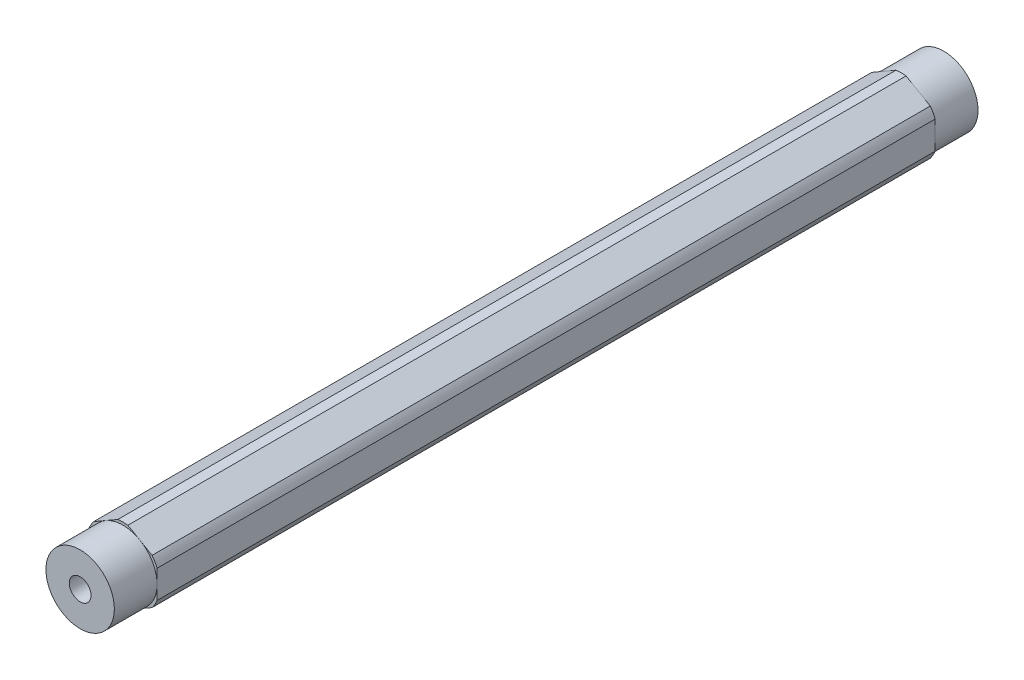
ISO-10303-21;
HEADER;
FILE_DESCRIPTION(('STEP AP214'),'2;1');
FILE_NAME('part.step','',(''),(''),'','','');
FILE_SCHEMA(('AUTOMOTIVE_DESIGN { 1 0 10303 214 1 1 1 1 }'));
ENDSEC;
DATA;
#1=APPLICATION_CONTEXT('core data for automotive mechanical design processes');
#2=APPLICATION_PROTOCOL_DEFINITION('international standard','automotive_design',2000,#1);
#3=PRODUCT_CONTEXT('',#1,'mechanical');
#4=PRODUCT('Part','Part','',(#3));
#5=PRODUCT_RELATED_PRODUCT_CATEGORY('part','',(#4));
#6=PRODUCT_DEFINITION_FORMATION('','',#4);
#7=PRODUCT_DEFINITION_CONTEXT('part definition',#1,'design');
#8=PRODUCT_DEFINITION('design','',#6,#7);
#9=PRODUCT_DEFINITION_SHAPE('','',#8);
#10=(LENGTH_UNIT() NAMED_UNIT(*) SI_UNIT(.MILLI.,.METRE.));
#11=(NAMED_UNIT(*) PLANE_ANGLE_UNIT() SI_UNIT($,.RADIAN.));
#12=(NAMED_UNIT(*) SI_UNIT($,.STERADIAN.) SOLID_ANGLE_UNIT());
#13=UNCERTAINTY_MEASURE_WITH_UNIT(LENGTH_MEASURE(1.E-05),#10,'distance_accuracy_value','');
#14=(GEOMETRIC_REPRESENTATION_CONTEXT(3) GLOBAL_UNCERTAINTY_ASSIGNED_CONTEXT((#13)) GLOBAL_UNIT_ASSIGNED_CONTEXT((#10,
#11,#12)) REPRESENTATION_CONTEXT('',''));
#15=CARTESIAN_POINT('',(0.,0.,0.));
#16=DIRECTION('',(0.,0.,1.));
#17=DIRECTION('',(1.,0.,0.));
#18=AXIS2_PLACEMENT_3D('',#15,#16,#17);
#19=CARTESIAN_POINT('',(0.,0.,-72.23125));
#20=DIRECTION('',(0.,0.,1.));
#21=DIRECTION('',(1.,0.,0.));
#22=AXIS2_PLACEMENT_3D('',#19,#20,#21);
#23=PLANE('',#22);
#24=DIRECTION('',(0.,1.,0.));
#25=VECTOR('',#24,1.);
#26=CARTESIAN_POINT('',(6.35,0.,-72.23125));
#27=LINE('',#26,#25);
#28=CARTESIAN_POINT('',(6.35,0.,-72.23125));
#29=VERTEX_POINT('',#28);
#30=CARTESIAN_POINT('',(6.35,2.59030191290514,-72.23125));
#31=VERTEX_POINT('',#30);
#32=EDGE_CURVE('E182',#29,#31,#27,.T.);
#33=ORIENTED_EDGE('',*,*,#32,.F.);
#34=CARTESIAN_POINT('',(0.,0.,-72.23125));
#35=DIRECTION('',(0.,0.,1.));
#36=DIRECTION('',(1.,0.,0.));
#37=AXIS2_PLACEMENT_3D('',#34,#35,#36);
#38=CIRCLE('',#37,6.35);
#39=CARTESIAN_POINT('',(3.175,5.49926131403119,-72.23125));
#40=VERTEX_POINT('',#39);
#41=EDGE_CURVE('E57',#29,#40,#38,.T.);
#42=ORIENTED_EDGE('',*,*,#41,.T.);
#43=DIRECTION('',(-0.866025403784439,0.5,0.));
#44=VECTOR('',#43,1.);
#45=CARTESIAN_POINT('',(3.175,5.49926131403119,-72.23125));
#46=LINE('',#45,#44);
#47=CARTESIAN_POINT('',(5.41826726004727,4.20411035757862,-72.23125));
#48=VERTEX_POINT('',#47);
#49=EDGE_CURVE('E181',#48,#40,#46,.T.);
#50=ORIENTED_EDGE('',*,*,#49,.F.);
#51=CARTESIAN_POINT('',(0.,0.,-72.23125));
#52=DIRECTION('',(0.,0.,1.));
#53=DIRECTION('',(1.,0.,0.));
#54=AXIS2_PLACEMENT_3D('',#51,#52,#53);
#55=CIRCLE('',#54,6.858);
#56=EDGE_CURVE('E196',#31,#48,#55,.T.);
#57=ORIENTED_EDGE('',*,*,#56,.F.);
#58=EDGE_LOOP('',(#33,#42,#50,#57));
#59=FACE_BOUND('',#58,.T.);
#60=ADVANCED_FACE('F45',(#59),#23,.F.);
#61=CARTESIAN_POINT('',(0.931732739952725,6.79441227048375,-72.23125));
#62=VERTEX_POINT('',#61);
#63=EDGE_CURVE('E189',#40,#62,#46,.T.);
#64=ORIENTED_EDGE('',*,*,#63,.F.);
#65=CARTESIAN_POINT('',(-3.175,5.49926131403119,-72.23125));
#66=VERTEX_POINT('',#65);
#67=EDGE_CURVE('E11',#40,#66,#38,.T.);
#68=ORIENTED_EDGE('',*,*,#67,.T.);
#69=DIRECTION('',(-0.866025403784439,-0.5,0.));
#70=VECTOR('',#69,1.);
#71=CARTESIAN_POINT('',(-3.175,5.49926131403118,-72.23125));
#72=LINE('',#71,#70);
#73=CARTESIAN_POINT('',(-0.931732739952721,6.79441227048375,-72.23125));
#74=VERTEX_POINT('',#73);
#75=EDGE_CURVE('E210',#74,#66,#72,.T.);
#76=ORIENTED_EDGE('',*,*,#75,.F.);
#77=EDGE_CURVE('E191',#62,#74,#55,.T.);
#78=ORIENTED_EDGE('',*,*,#77,.F.);
#79=EDGE_LOOP('',(#64,#68,#76,#78));
#80=FACE_BOUND('',#79,.T.);
#81=ADVANCED_FACE('F190',(#80),#23,.F.);
#82=CARTESIAN_POINT('',(-5.41826726004728,4.20411035757862,-72.23125));
#83=VERTEX_POINT('',#82);
#84=EDGE_CURVE('E205',#66,#83,#72,.T.);
#85=ORIENTED_EDGE('',*,*,#84,.F.);
#86=CARTESIAN_POINT('',(-6.35,0.,-72.23125));
#87=VERTEX_POINT('',#86);
#88=EDGE_CURVE('E55',#66,#87,#38,.T.);
#89=ORIENTED_EDGE('',*,*,#88,.T.);
#90=DIRECTION('',(0.,-1.,0.));
#91=VECTOR('',#90,1.);
#92=CARTESIAN_POINT('',(-6.35,0.,-72.23125));
#93=LINE('',#92,#91);
#94=CARTESIAN_POINT('',(-6.35,2.59030191290514,-72.23125));
#95=VERTEX_POINT('',#94);
#96=EDGE_CURVE('E214',#95,#87,#93,.T.);
#97=ORIENTED_EDGE('',*,*,#96,.F.);
#98=EDGE_CURVE('E207',#83,#95,#55,.T.);
#99=ORIENTED_EDGE('',*,*,#98,.F.);
#100=EDGE_LOOP('',(#85,#89,#97,#99));
#101=FACE_BOUND('',#100,.T.);
#102=ADVANCED_FACE('F433',(#101),#23,.F.);
#103=CARTESIAN_POINT('',(-6.35,-2.59030191290514,-72.23125));
#104=VERTEX_POINT('',#103);
#105=EDGE_CURVE('E219',#87,#104,#93,.T.);
#106=ORIENTED_EDGE('',*,*,#105,.F.);
#107=CARTESIAN_POINT('',(-3.175,-5.49926131403119,-72.23125));
#108=VERTEX_POINT('',#107);
#109=EDGE_CURVE('E397',#87,#108,#38,.T.);
#110=ORIENTED_EDGE('',*,*,#109,.T.);
#111=DIRECTION('',(0.866025403784439,-0.5,0.));
#112=VECTOR('',#111,1.);
#113=CARTESIAN_POINT('',(-3.175,-5.49926131403118,-72.23125));
#114=LINE('',#113,#112);
#115=CARTESIAN_POINT('',(-5.41826726004728,-4.20411035757861,-72.23125));
#116=VERTEX_POINT('',#115);
#117=EDGE_CURVE('E220',#116,#108,#114,.T.);
#118=ORIENTED_EDGE('',*,*,#117,.F.);
#119=EDGE_CURVE('E218',#104,#116,#55,.T.);
#120=ORIENTED_EDGE('',*,*,#119,.F.);
#121=EDGE_LOOP('',(#106,#110,#118,#120));
#122=FACE_BOUND('',#121,.T.);
#123=ADVANCED_FACE('F396',(#122),#23,.F.);
#124=CARTESIAN_POINT('',(-0.931732739952714,-6.79441227048375,-72.23125));
#125=VERTEX_POINT('',#124);
#126=EDGE_CURVE('E225',#108,#125,#114,.T.);
#127=ORIENTED_EDGE('',*,*,#126,.F.);
#128=CARTESIAN_POINT('',(3.175,-5.49926131403119,-72.23125));
#129=VERTEX_POINT('',#128);
#130=EDGE_CURVE('E304',#108,#129,#38,.T.);
#131=ORIENTED_EDGE('',*,*,#130,.T.);
#132=DIRECTION('',(0.866025403784439,0.5,0.));
#133=VECTOR('',#132,1.);
#134=CARTESIAN_POINT('',(3.175,-5.49926131403119,-72.23125));
#135=LINE('',#134,#133);
#136=CARTESIAN_POINT('',(0.931732739952726,-6.79441227048375,-72.23125));
#137=VERTEX_POINT('',#136);
#138=EDGE_CURVE('E226',#137,#129,#135,.T.);
#139=ORIENTED_EDGE('',*,*,#138,.F.);
#140=EDGE_CURVE('E224',#125,#137,#55,.T.);
#141=ORIENTED_EDGE('',*,*,#140,.F.);
#142=EDGE_LOOP('',(#127,#131,#139,#141));
#143=FACE_BOUND('',#142,.T.);
#144=ADVANCED_FACE('F416',(#143),#23,.F.);
#145=CARTESIAN_POINT('',(0.,0.,72.23125));
#146=DIRECTION('',(0.,0.,1.));
#147=DIRECTION('',(1.,0.,0.));
#148=AXIS2_PLACEMENT_3D('',#145,#146,#147);
#149=PLANE('',#148);
#150=CARTESIAN_POINT('',(0.,0.,72.23125));
#151=DIRECTION('',(0.,0.,1.));
#152=DIRECTION('',(1.,0.,0.));
#153=AXIS2_PLACEMENT_3D('',#150,#151,#152);
#154=CIRCLE('',#153,6.35);
#155=CARTESIAN_POINT('',(6.35,0.,72.23125));
#156=VERTEX_POINT('',#155);
#157=CARTESIAN_POINT('',(3.175,5.49926131403119,72.23125));
#158=VERTEX_POINT('',#157);
#159=EDGE_CURVE('E280',#156,#158,#154,.T.);
#160=ORIENTED_EDGE('',*,*,#159,.F.);
#161=DIRECTION('',(0.,1.,0.));
#162=VECTOR('',#161,1.);
#163=CARTESIAN_POINT('',(6.35,0.,72.23125));
#164=LINE('',#163,#162);
#165=CARTESIAN_POINT('',(6.35,2.59030191290514,72.23125));
#166=VERTEX_POINT('',#165);
#167=EDGE_CURVE('E369',#156,#166,#164,.T.);
#168=ORIENTED_EDGE('',*,*,#167,.T.);
#169=CARTESIAN_POINT('',(0.,0.,72.23125));
#170=DIRECTION('',(0.,0.,1.));
#171=DIRECTION('',(1.,0.,0.));
#172=AXIS2_PLACEMENT_3D('',#169,#170,#171);
#173=CIRCLE('',#172,6.858);
#174=CARTESIAN_POINT('',(5.41826726004727,4.20411035757862,72.23125));
#175=VERTEX_POINT('',#174);
#176=EDGE_CURVE('E355',#166,#175,#173,.T.);
#177=ORIENTED_EDGE('',*,*,#176,.T.);
#178=DIRECTION('',(-0.866025403784439,0.5,0.));
#179=VECTOR('',#178,1.);
#180=CARTESIAN_POINT('',(3.175,5.49926131403119,72.23125));
#181=LINE('',#180,#179);
#182=EDGE_CURVE('E358',#175,#158,#181,.T.);
#183=ORIENTED_EDGE('',*,*,#182,.T.);
#184=EDGE_LOOP('',(#160,#168,#177,#183));
#185=FACE_BOUND('',#184,.T.);
#186=ADVANCED_FACE('F413',(#185),#149,.T.);
#187=CARTESIAN_POINT('',(-3.175,5.49926131403119,72.23125));
#188=VERTEX_POINT('',#187);
#189=EDGE_CURVE('E291',#158,#188,#154,.T.);
#190=ORIENTED_EDGE('',*,*,#189,.F.);
#191=CARTESIAN_POINT('',(0.931732739952725,6.79441227048375,72.23125));
#192=VERTEX_POINT('',#191);
#193=EDGE_CURVE('E359',#158,#192,#181,.T.);
#194=ORIENTED_EDGE('',*,*,#193,.T.);
#195=CARTESIAN_POINT('',(-0.931732739952721,6.79441227048375,72.23125));
#196=VERTEX_POINT('',#195);
#197=EDGE_CURVE('E362',#192,#196,#173,.T.);
#198=ORIENTED_EDGE('',*,*,#197,.T.);
#199=DIRECTION('',(-0.866025403784439,-0.5,0.));
#200=VECTOR('',#199,1.);
#201=CARTESIAN_POINT('',(-3.175,5.49926131403118,72.23125));
#202=LINE('',#201,#200);
#203=EDGE_CURVE('E338',#196,#188,#202,.T.);
#204=ORIENTED_EDGE('',*,*,#203,.T.);
#205=EDGE_LOOP('',(#190,#194,#198,#204));
#206=FACE_BOUND('',#205,.T.);
#207=ADVANCED_FACE('F415',(#206),#149,.T.);
#208=CARTESIAN_POINT('',(-6.35,0.,72.23125));
#209=VERTEX_POINT('',#208);
#210=EDGE_CURVE('E300',#188,#209,#154,.T.);
#211=ORIENTED_EDGE('',*,*,#210,.F.);
#212=CARTESIAN_POINT('',(-5.41826726004728,4.20411035757862,72.23125));
#213=VERTEX_POINT('',#212);
#214=EDGE_CURVE('E365',#188,#213,#202,.T.);
#215=ORIENTED_EDGE('',*,*,#214,.T.);
#216=CARTESIAN_POINT('',(-6.35,2.59030191290514,72.23125));
#217=VERTEX_POINT('',#216);
#218=EDGE_CURVE('E323',#213,#217,#173,.T.);
#219=ORIENTED_EDGE('',*,*,#218,.T.);
#220=DIRECTION('',(0.,-1.,0.));
#221=VECTOR('',#220,1.);
#222=CARTESIAN_POINT('',(-6.35,0.,72.23125));
#223=LINE('',#222,#221);
#224=EDGE_CURVE('E320',#217,#209,#223,.T.);
#225=ORIENTED_EDGE('',*,*,#224,.T.);
#226=EDGE_LOOP('',(#211,#215,#219,#225));
#227=FACE_BOUND('',#226,.T.);
#228=ADVANCED_FACE('F326',(#227),#149,.T.);
#229=CARTESIAN_POINT('',(-3.175,-5.49926131403118,72.23125));
#230=VERTEX_POINT('',#229);
#231=EDGE_CURVE('E285',#209,#230,#154,.T.);
#232=ORIENTED_EDGE('',*,*,#231,.F.);
#233=CARTESIAN_POINT('',(-6.35,-2.59030191290514,72.23125));
#234=VERTEX_POINT('',#233);
#235=EDGE_CURVE('E312',#209,#234,#223,.T.);
#236=ORIENTED_EDGE('',*,*,#235,.T.);
#237=CARTESIAN_POINT('',(-5.41826726004728,-4.20411035757861,72.23125));
#238=VERTEX_POINT('',#237);
#239=EDGE_CURVE('E331',#234,#238,#173,.T.);
#240=ORIENTED_EDGE('',*,*,#239,.T.);
#241=DIRECTION('',(0.866025403784439,-0.5,0.));
#242=VECTOR('',#241,1.);
#243=CARTESIAN_POINT('',(-3.175,-5.49926131403118,72.23125));
#244=LINE('',#243,#242);
#245=EDGE_CURVE('E315',#238,#230,#244,.T.);
#246=ORIENTED_EDGE('',*,*,#245,.T.);
#247=EDGE_LOOP('',(#232,#236,#240,#246));
#248=FACE_BOUND('',#247,.T.);
#249=ADVANCED_FACE('F311',(#248),#149,.T.);
#250=CARTESIAN_POINT('',(3.175,-5.49926131403119,72.23125));
#251=VERTEX_POINT('',#250);
#252=EDGE_CURVE('E278',#230,#251,#154,.T.);
#253=ORIENTED_EDGE('',*,*,#252,.F.);
#254=CARTESIAN_POINT('',(-0.931732739952714,-6.79441227048375,72.23125));
#255=VERTEX_POINT('',#254);
#256=EDGE_CURVE('E333',#230,#255,#244,.T.);
#257=ORIENTED_EDGE('',*,*,#256,.T.);
#258=CARTESIAN_POINT('',(0.931732739952726,-6.79441227048375,72.23125));
#259=VERTEX_POINT('',#258);
#260=EDGE_CURVE('E335',#255,#259,#173,.T.);
#261=ORIENTED_EDGE('',*,*,#260,.T.);
#262=DIRECTION('',(0.866025403784439,0.5,0.));
#263=VECTOR('',#262,1.);
#264=CARTESIAN_POINT('',(3.175,-5.49926131403119,72.23125));
#265=LINE('',#264,#263);
#266=EDGE_CURVE('E342',#259,#251,#265,.T.);
#267=ORIENTED_EDGE('',*,*,#266,.T.);
#268=EDGE_LOOP('',(#253,#257,#261,#267));
#269=FACE_BOUND('',#268,.T.);
#270=ADVANCED_FACE('F428',(#269),#149,.T.);
#271=CARTESIAN_POINT('',(6.35,0.,72.23125));
#272=DIRECTION('',(-1.,0.,0.));
#273=DIRECTION('',(0.,-1.,0.));
#274=AXIS2_PLACEMENT_3D('',#271,#272,#273);
#275=PLANE('',#274);
#276=CARTESIAN_POINT('',(6.35,-2.59030191290513,-72.23125));
#277=VERTEX_POINT('',#276);
#278=EDGE_CURVE('E346',#277,#29,#27,.T.);
#279=ORIENTED_EDGE('',*,*,#278,.T.);
#280=ORIENTED_EDGE('',*,*,#32,.T.);
#281=DIRECTION('',(0.,0.,-1.));
#282=VECTOR('',#281,1.);
#283=CARTESIAN_POINT('',(6.35,2.59030191290514,72.23125));
#284=LINE('',#283,#282);
#285=EDGE_CURVE('E49',#166,#31,#284,.T.);
#286=ORIENTED_EDGE('',*,*,#285,.F.);
#287=ORIENTED_EDGE('',*,*,#167,.F.);
#288=CARTESIAN_POINT('',(6.35,-2.59030191290513,72.23125));
#289=VERTEX_POINT('',#288);
#290=EDGE_CURVE('E367',#289,#156,#164,.T.);
#291=ORIENTED_EDGE('',*,*,#290,.F.);
#292=DIRECTION('',(0.,0.,-1.));
#293=VECTOR('',#292,1.);
#294=CARTESIAN_POINT('',(6.35,-2.59030191290513,72.23125));
#295=LINE('',#294,#293);
#296=EDGE_CURVE('E232',#289,#277,#295,.T.);
#297=ORIENTED_EDGE('',*,*,#296,.T.);
#298=EDGE_LOOP('',(#279,#280,#286,#287,#291,#297));
#299=FACE_BOUND('',#298,.T.);
#300=ADVANCED_FACE('F352',(#299),#275,.F.);
#301=CARTESIAN_POINT('',(0.,0.,72.23125));
#302=DIRECTION('',(0.,0.,-1.));
#303=DIRECTION('',(-1.,0.,0.));
#304=AXIS2_PLACEMENT_3D('',#301,#302,#303);
#305=CYLINDRICAL_SURFACE('',#304,6.858);
#306=ORIENTED_EDGE('',*,*,#56,.T.);
#307=DIRECTION('',(0.,0.,-1.));
#308=VECTOR('',#307,1.);
#309=CARTESIAN_POINT('',(5.41826726004727,4.20411035757862,72.23125));
#310=LINE('',#309,#308);
#311=EDGE_CURVE('E202',#175,#48,#310,.T.);
#312=ORIENTED_EDGE('',*,*,#311,.F.);
#313=ORIENTED_EDGE('',*,*,#176,.F.);
#314=ORIENTED_EDGE('',*,*,#285,.T.);
#315=EDGE_LOOP('',(#306,#312,#313,#314));
#316=FACE_BOUND('',#315,.T.);
#317=ADVANCED_FACE('F354',(#316),#305,.T.);
#318=CARTESIAN_POINT('',(3.175,5.49926131403119,72.23125));
#319=DIRECTION('',(-0.5,-0.866025403784439,0.));
#320=DIRECTION('',(0.866025403784439,-0.5,0.));
#321=AXIS2_PLACEMENT_3D('',#318,#319,#320);
#322=PLANE('',#321);
#323=ORIENTED_EDGE('',*,*,#49,.T.);
#324=ORIENTED_EDGE('',*,*,#63,.T.);
#325=DIRECTION('',(0.,0.,-1.));
#326=VECTOR('',#325,1.);
#327=CARTESIAN_POINT('',(0.931732739952725,6.79441227048375,72.23125));
#328=LINE('',#327,#326);
#329=EDGE_CURVE('E269',#192,#62,#328,.T.);
#330=ORIENTED_EDGE('',*,*,#329,.F.);
#331=ORIENTED_EDGE('',*,*,#193,.F.);
#332=ORIENTED_EDGE('',*,*,#182,.F.);
#333=ORIENTED_EDGE('',*,*,#311,.T.);
#334=EDGE_LOOP('',(#323,#324,#330,#331,#332,#333));
#335=FACE_BOUND('',#334,.T.);
#336=ADVANCED_FACE('F199',(#335),#322,.F.);
#337=ORIENTED_EDGE('',*,*,#77,.T.);
#338=DIRECTION('',(0.,0.,-1.));
#339=VECTOR('',#338,1.);
#340=CARTESIAN_POINT('',(-0.931732739952721,6.79441227048375,72.23125));
#341=LINE('',#340,#339);
#342=EDGE_CURVE('E265',#196,#74,#341,.T.);
#343=ORIENTED_EDGE('',*,*,#342,.F.);
#344=ORIENTED_EDGE('',*,*,#197,.F.);
#345=ORIENTED_EDGE('',*,*,#329,.T.);
#346=EDGE_LOOP('',(#337,#343,#344,#345));
#347=FACE_BOUND('',#346,.T.);
#348=ADVANCED_FACE('F484',(#347),#305,.T.);
#349=CARTESIAN_POINT('',(-3.175,5.49926131403118,72.23125));
#350=DIRECTION('',(0.5,-0.866025403784439,0.));
#351=DIRECTION('',(0.866025403784439,0.5,0.));
#352=AXIS2_PLACEMENT_3D('',#349,#350,#351);
#353=PLANE('',#352);
#354=ORIENTED_EDGE('',*,*,#75,.T.);
#355=ORIENTED_EDGE('',*,*,#84,.T.);
#356=DIRECTION('',(0.,0.,-1.));
#357=VECTOR('',#356,1.);
#358=CARTESIAN_POINT('',(-5.41826726004728,4.20411035757862,72.23125));
#359=LINE('',#358,#357);
#360=EDGE_CURVE('E261',#213,#83,#359,.T.);
#361=ORIENTED_EDGE('',*,*,#360,.F.);
#362=ORIENTED_EDGE('',*,*,#214,.F.);
#363=ORIENTED_EDGE('',*,*,#203,.F.);
#364=ORIENTED_EDGE('',*,*,#342,.T.);
#365=EDGE_LOOP('',(#354,#355,#361,#362,#363,#364));
#366=FACE_BOUND('',#365,.T.);
#367=ADVANCED_FACE('F481',(#366),#353,.F.);
#368=ORIENTED_EDGE('',*,*,#98,.T.);
#369=DIRECTION('',(0.,0.,-1.));
#370=VECTOR('',#369,1.);
#371=CARTESIAN_POINT('',(-6.35,2.59030191290514,72.23125));
#372=LINE('',#371,#370);
#373=EDGE_CURVE('E257',#217,#95,#372,.T.);
#374=ORIENTED_EDGE('',*,*,#373,.F.);
#375=ORIENTED_EDGE('',*,*,#218,.F.);
#376=ORIENTED_EDGE('',*,*,#360,.T.);
#377=EDGE_LOOP('',(#368,#374,#375,#376));
#378=FACE_BOUND('',#377,.T.);
#379=ADVANCED_FACE('F480',(#378),#305,.T.);
#380=CARTESIAN_POINT('',(-6.35,0.,72.23125));
#381=DIRECTION('',(1.,0.,0.));
#382=DIRECTION('',(0.,1.,0.));
#383=AXIS2_PLACEMENT_3D('',#380,#381,#382);
#384=PLANE('',#383);
#385=ORIENTED_EDGE('',*,*,#96,.T.);
#386=ORIENTED_EDGE('',*,*,#105,.T.);
#387=DIRECTION('',(0.,0.,-1.));
#388=VECTOR('',#387,1.);
#389=CARTESIAN_POINT('',(-6.35,-2.59030191290514,72.23125));
#390=LINE('',#389,#388);
#391=EDGE_CURVE('E253',#234,#104,#390,.T.);
#392=ORIENTED_EDGE('',*,*,#391,.F.);
#393=ORIENTED_EDGE('',*,*,#235,.F.);
#394=ORIENTED_EDGE('',*,*,#224,.F.);
#395=ORIENTED_EDGE('',*,*,#373,.T.);
#396=EDGE_LOOP('',(#385,#386,#392,#393,#394,#395));
#397=FACE_BOUND('',#396,.T.);
#398=ADVANCED_FACE('F319',(#397),#384,.F.);
#399=ORIENTED_EDGE('',*,*,#119,.T.);
#400=DIRECTION('',(0.,0.,-1.));
#401=VECTOR('',#400,1.);
#402=CARTESIAN_POINT('',(-5.41826726004728,-4.20411035757861,72.23125));
#403=LINE('',#402,#401);
#404=EDGE_CURVE('E249',#238,#116,#403,.T.);
#405=ORIENTED_EDGE('',*,*,#404,.F.);
#406=ORIENTED_EDGE('',*,*,#239,.F.);
#407=ORIENTED_EDGE('',*,*,#391,.T.);
#408=EDGE_LOOP('',(#399,#405,#406,#407));
#409=FACE_BOUND('',#408,.T.);
#410=ADVANCED_FACE('F394',(#409),#305,.T.);
#411=CARTESIAN_POINT('',(-3.175,-5.49926131403118,72.23125));
#412=DIRECTION('',(0.5,0.866025403784439,0.));
#413=DIRECTION('',(-0.866025403784439,0.5,0.));
#414=AXIS2_PLACEMENT_3D('',#411,#412,#413);
#415=PLANE('',#414);
#416=ORIENTED_EDGE('',*,*,#117,.T.);
#417=ORIENTED_EDGE('',*,*,#126,.T.);
#418=DIRECTION('',(0.,0.,-1.));
#419=VECTOR('',#418,1.);
#420=CARTESIAN_POINT('',(-0.931732739952714,-6.79441227048375,72.23125));
#421=LINE('',#420,#419);
#422=EDGE_CURVE('E245',#255,#125,#421,.T.);
#423=ORIENTED_EDGE('',*,*,#422,.F.);
#424=ORIENTED_EDGE('',*,*,#256,.F.);
#425=ORIENTED_EDGE('',*,*,#245,.F.);
#426=ORIENTED_EDGE('',*,*,#404,.T.);
#427=EDGE_LOOP('',(#416,#417,#423,#424,#425,#426));
#428=FACE_BOUND('',#427,.T.);
#429=ADVANCED_FACE('F400',(#428),#415,.F.);
#430=ORIENTED_EDGE('',*,*,#140,.T.);
#431=DIRECTION('',(0.,0.,-1.));
#432=VECTOR('',#431,1.);
#433=CARTESIAN_POINT('',(0.931732739952726,-6.79441227048375,72.23125));
#434=LINE('',#433,#432);
#435=EDGE_CURVE('E241',#259,#137,#434,.T.);
#436=ORIENTED_EDGE('',*,*,#435,.F.);
#437=ORIENTED_EDGE('',*,*,#260,.F.);
#438=ORIENTED_EDGE('',*,*,#422,.T.);
#439=EDGE_LOOP('',(#430,#436,#437,#438));
#440=FACE_BOUND('',#439,.T.);
#441=ADVANCED_FACE('F468',(#440),#305,.T.);
#442=CARTESIAN_POINT('',(3.175,-5.49926131403119,72.23125));
#443=DIRECTION('',(-0.5,0.866025403784439,0.));
#444=DIRECTION('',(-0.866025403784439,-0.5,0.));
#445=AXIS2_PLACEMENT_3D('',#442,#443,#444);
#446=PLANE('',#445);
#447=ORIENTED_EDGE('',*,*,#138,.T.);
#448=CARTESIAN_POINT('',(5.41826726004727,-4.20411035757862,-72.23125));
#449=VERTEX_POINT('',#448);
#450=EDGE_CURVE('E231',#129,#449,#135,.T.);
#451=ORIENTED_EDGE('',*,*,#450,.T.);
#452=DIRECTION('',(0.,0.,-1.));
#453=VECTOR('',#452,1.);
#454=CARTESIAN_POINT('',(5.41826726004727,-4.20411035757862,72.23125));
#455=LINE('',#454,#453);
#456=CARTESIAN_POINT('',(5.41826726004727,-4.20411035757862,72.23125));
#457=VERTEX_POINT('',#456);
#458=EDGE_CURVE('E236',#457,#449,#455,.T.);
#459=ORIENTED_EDGE('',*,*,#458,.F.);
#460=EDGE_CURVE('E345',#251,#457,#265,.T.);
#461=ORIENTED_EDGE('',*,*,#460,.F.);
#462=ORIENTED_EDGE('',*,*,#266,.F.);
#463=ORIENTED_EDGE('',*,*,#435,.T.);
#464=EDGE_LOOP('',(#447,#451,#459,#461,#462,#463));
#465=FACE_BOUND('',#464,.T.);
#466=ADVANCED_FACE('F446',(#465),#446,.F.);
#467=CARTESIAN_POINT('',(0.,0.,72.23125));
#468=DIRECTION('',(0.,0.,-1.));
#469=DIRECTION('',(-1.,0.,0.));
#470=AXIS2_PLACEMENT_3D('',#467,#468,#469);
#471=CYLINDRICAL_SURFACE('',#470,2.0193);
#472=CARTESIAN_POINT('',(0.,0.,80.16875));
#473=DIRECTION('',(0.,0.,1.));
#474=DIRECTION('',(1.,0.,0.));
#475=AXIS2_PLACEMENT_3D('',#472,#473,#474);
#476=CIRCLE('',#475,2.0193);
#477=CARTESIAN_POINT('',(2.0193,0.,80.16875));
#478=VERTEX_POINT('',#477);
#479=EDGE_CURVE('E290',#478,#478,#476,.T.);
#480=ORIENTED_EDGE('',*,*,#479,.T.);
#481=EDGE_LOOP('',(#480));
#482=FACE_BOUND('',#481,.T.);
#483=CARTESIAN_POINT('',(0.,0.,-80.16875));
#484=DIRECTION('',(0.,0.,1.));
#485=DIRECTION('',(1.,0.,0.));
#486=AXIS2_PLACEMENT_3D('',#483,#484,#485);
#487=CIRCLE('',#486,2.0193);
#488=CARTESIAN_POINT('',(2.0193,0.,-80.16875));
#489=VERTEX_POINT('',#488);
#490=EDGE_CURVE('E186',#489,#489,#487,.T.);
#491=ORIENTED_EDGE('',*,*,#490,.F.);
#492=EDGE_LOOP('',(#491));
#493=FACE_BOUND('',#492,.T.);
#494=ADVANCED_FACE('F47',(#482,#493),#471,.F.);
#495=EDGE_CURVE('E230',#449,#277,#55,.T.);
#496=ORIENTED_EDGE('',*,*,#495,.T.);
#497=ORIENTED_EDGE('',*,*,#296,.F.);
#498=EDGE_CURVE('E237',#457,#289,#173,.T.);
#499=ORIENTED_EDGE('',*,*,#498,.F.);
#500=ORIENTED_EDGE('',*,*,#458,.T.);
#501=EDGE_LOOP('',(#496,#497,#499,#500));
#502=FACE_BOUND('',#501,.T.);
#503=ADVANCED_FACE('F412',(#502),#305,.T.);
#504=EDGE_CURVE('E71',#251,#156,#154,.T.);
#505=ORIENTED_EDGE('',*,*,#504,.F.);
#506=ORIENTED_EDGE('',*,*,#460,.T.);
#507=ORIENTED_EDGE('',*,*,#498,.T.);
#508=ORIENTED_EDGE('',*,*,#290,.T.);
#509=EDGE_LOOP('',(#505,#506,#507,#508));
#510=FACE_BOUND('',#509,.T.);
#511=ADVANCED_FACE('F410',(#510),#149,.T.);
#512=ORIENTED_EDGE('',*,*,#450,.F.);
#513=EDGE_CURVE('E187',#129,#29,#38,.T.);
#514=ORIENTED_EDGE('',*,*,#513,.T.);
#515=ORIENTED_EDGE('',*,*,#278,.F.);
#516=ORIENTED_EDGE('',*,*,#495,.F.);
#517=EDGE_LOOP('',(#512,#514,#515,#516));
#518=FACE_BOUND('',#517,.T.);
#519=ADVANCED_FACE('F425',(#518),#23,.F.);
#520=CARTESIAN_POINT('',(0.,0.,80.16875));
#521=DIRECTION('',(0.,0.,1.));
#522=DIRECTION('',(1.,0.,0.));
#523=AXIS2_PLACEMENT_3D('',#520,#521,#522);
#524=PLANE('',#523);
#525=CARTESIAN_POINT('',(0.,0.,80.16875));
#526=DIRECTION('',(0.,0.,1.));
#527=DIRECTION('',(1.,0.,0.));
#528=AXIS2_PLACEMENT_3D('',#525,#526,#527);
#529=CIRCLE('',#528,6.35);
#530=CARTESIAN_POINT('',(6.35,0.,80.16875));
#531=VERTEX_POINT('',#530);
#532=EDGE_CURVE('E289',#531,#531,#529,.T.);
#533=ORIENTED_EDGE('',*,*,#532,.T.);
#534=EDGE_LOOP('',(#533));
#535=FACE_BOUND('',#534,.T.);
#536=ORIENTED_EDGE('',*,*,#479,.F.);
#537=EDGE_LOOP('',(#536));
#538=FACE_BOUND('',#537,.T.);
#539=ADVANCED_FACE('F436',(#535,#538),#524,.T.);
#540=CARTESIAN_POINT('',(0.,0.,80.16875));
#541=DIRECTION('',(0.,0.,-1.));
#542=DIRECTION('',(-1.,0.,0.));
#543=AXIS2_PLACEMENT_3D('',#540,#541,#542);
#544=CYLINDRICAL_SURFACE('',#543,6.35);
#545=ORIENTED_EDGE('',*,*,#532,.F.);
#546=EDGE_LOOP('',(#545));
#547=FACE_BOUND('',#546,.T.);
#548=ORIENTED_EDGE('',*,*,#159,.T.);
#549=ORIENTED_EDGE('',*,*,#189,.T.);
#550=ORIENTED_EDGE('',*,*,#210,.T.);
#551=ORIENTED_EDGE('',*,*,#231,.T.);
#552=ORIENTED_EDGE('',*,*,#252,.T.);
#553=ORIENTED_EDGE('',*,*,#504,.T.);
#554=EDGE_LOOP('',(#548,#549,#550,#551,#552,#553));
#555=FACE_BOUND('',#554,.T.);
#556=ADVANCED_FACE('F307',(#547,#555),#544,.T.);
#557=CARTESIAN_POINT('',(0.,0.,-80.16875));
#558=DIRECTION('',(0.,0.,1.));
#559=DIRECTION('',(1.,0.,0.));
#560=AXIS2_PLACEMENT_3D('',#557,#558,#559);
#561=CYLINDRICAL_SURFACE('',#560,6.35);
#562=CARTESIAN_POINT('',(0.,0.,-80.16875));
#563=DIRECTION('',(0.,0.,1.));
#564=DIRECTION('',(1.,0.,0.));
#565=AXIS2_PLACEMENT_3D('',#562,#563,#564);
#566=CIRCLE('',#565,6.35);
#567=CARTESIAN_POINT('',(6.35,0.,-80.16875));
#568=VERTEX_POINT('',#567);
#569=EDGE_CURVE('E185',#568,#568,#566,.T.);
#570=ORIENTED_EDGE('',*,*,#569,.T.);
#571=EDGE_LOOP('',(#570));
#572=FACE_BOUND('',#571,.T.);
#573=ORIENTED_EDGE('',*,*,#41,.F.);
#574=ORIENTED_EDGE('',*,*,#513,.F.);
#575=ORIENTED_EDGE('',*,*,#130,.F.);
#576=ORIENTED_EDGE('',*,*,#109,.F.);
#577=ORIENTED_EDGE('',*,*,#88,.F.);
#578=ORIENTED_EDGE('',*,*,#67,.F.);
#579=EDGE_LOOP('',(#573,#574,#575,#576,#577,#578));
#580=FACE_BOUND('',#579,.T.);
#581=ADVANCED_FACE('F170',(#572,#580),#561,.T.);
#582=CARTESIAN_POINT('',(0.,0.,-80.16875));
#583=DIRECTION('',(0.,0.,-1.));
#584=DIRECTION('',(1.,0.,0.));
#585=AXIS2_PLACEMENT_3D('',#582,#583,#584);
#586=PLANE('',#585);
#587=ORIENTED_EDGE('',*,*,#490,.T.);
#588=EDGE_LOOP('',(#587));
#589=FACE_BOUND('',#588,.T.);
#590=ORIENTED_EDGE('',*,*,#569,.F.);
#591=EDGE_LOOP('',(#590));
#592=FACE_BOUND('',#591,.T.);
#593=ADVANCED_FACE('F459',(#589,#592),#586,.T.);
#594=CLOSED_SHELL('',(#60,#81,#102,#123,#144,#186,#207,#228,#249,#270,#300,#317,#336,#348,#367,
#379,#398,#410,#429,#441,#466,#494,#503,#511,#519,#539,#556,#581,#593));
#595=MANIFOLD_SOLID_BREP('B2',#594);
#596=ADVANCED_BREP_SHAPE_REPRESENTATION('',(#18,#595),#14);
#597=SHAPE_DEFINITION_REPRESENTATION(#9,#596);
ENDSEC;
END-ISO-10303-21;
